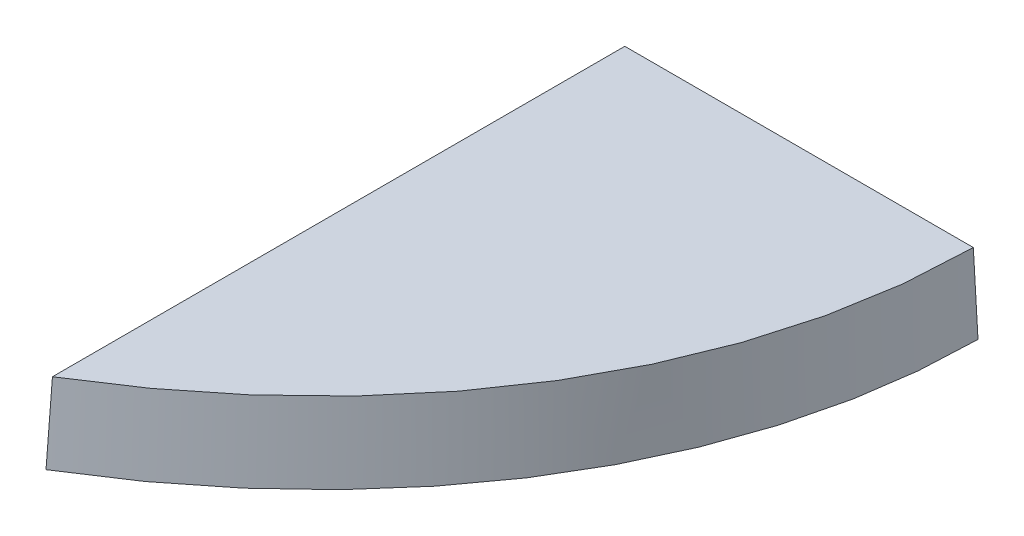
ISO-10303-21;
HEADER;
FILE_DESCRIPTION(('STEP AP214'),'2;1');
FILE_NAME('part.step','',(''),(''),'','','');
FILE_SCHEMA(('AUTOMOTIVE_DESIGN { 1 0 10303 214 1 1 1 1 }'));
ENDSEC;
DATA;
#1=APPLICATION_CONTEXT('core data for automotive mechanical design processes');
#2=APPLICATION_PROTOCOL_DEFINITION('international standard','automotive_design',2000,#1);
#3=PRODUCT_CONTEXT('',#1,'mechanical');
#4=PRODUCT('Part','Part','',(#3));
#5=PRODUCT_RELATED_PRODUCT_CATEGORY('part','',(#4));
#6=PRODUCT_DEFINITION_FORMATION('','',#4);
#7=PRODUCT_DEFINITION_CONTEXT('part definition',#1,'design');
#8=PRODUCT_DEFINITION('design','',#6,#7);
#9=PRODUCT_DEFINITION_SHAPE('','',#8);
#10=(LENGTH_UNIT() NAMED_UNIT(*) SI_UNIT(.MILLI.,.METRE.));
#11=(NAMED_UNIT(*) PLANE_ANGLE_UNIT() SI_UNIT($,.RADIAN.));
#12=(NAMED_UNIT(*) SI_UNIT($,.STERADIAN.) SOLID_ANGLE_UNIT());
#13=UNCERTAINTY_MEASURE_WITH_UNIT(LENGTH_MEASURE(1.E-05),#10,'distance_accuracy_value','');
#14=(GEOMETRIC_REPRESENTATION_CONTEXT(3) GLOBAL_UNCERTAINTY_ASSIGNED_CONTEXT((#13)) GLOBAL_UNIT_ASSIGNED_CONTEXT((#10,
#11,#12)) REPRESENTATION_CONTEXT('',''));
#15=CARTESIAN_POINT('',(0.,0.,0.));
#16=DIRECTION('',(0.,0.,1.));
#17=DIRECTION('',(1.,0.,0.));
#18=AXIS2_PLACEMENT_3D('',#15,#16,#17);
#19=CARTESIAN_POINT('',(0.,0.,0.));
#20=DIRECTION('',(0.,0.,1.));
#21=DIRECTION('',(1.,0.,0.));
#22=AXIS2_PLACEMENT_3D('',#19,#20,#21);
#23=PLANE('',#22);
#24=CARTESIAN_POINT('',(37.2881564006706,-186.5,0.));
#25=CARTESIAN_POINT('',(37.3587709337804,-187.666666666667,0.));
#26=CARTESIAN_POINT('',(37.4293854668902,-188.833333333333,0.));
#27=CARTESIAN_POINT('',(37.5,-190.,0.));
#28=B_SPLINE_CURVE_WITH_KNOTS('',3,(#24,#25,#26,#27),.UNSPECIFIED.,.F.,.F.,(4,4),(0.,
3.50640524049584),.UNSPECIFIED.);
#29=CARTESIAN_POINT('',(37.2881564006706,-186.5,0.));
#30=VERTEX_POINT('',#29);
#31=CARTESIAN_POINT('',(37.5,-190.,0.));
#32=VERTEX_POINT('',#31);
#33=EDGE_CURVE('E88',#30,#32,#28,.T.);
#34=ORIENTED_EDGE('',*,*,#33,.T.);
#35=DIRECTION('',(1.,0.,0.));
#36=VECTOR('',#35,1.);
#37=CARTESIAN_POINT('',(0.,-190.,0.));
#38=LINE('',#37,#36);
#39=CARTESIAN_POINT('',(21.5,-190.,0.));
#40=VERTEX_POINT('',#39);
#41=EDGE_CURVE('E79',#40,#32,#38,.T.);
#42=ORIENTED_EDGE('',*,*,#41,.F.);
#43=DIRECTION('',(0.,-1.,0.));
#44=VECTOR('',#43,1.);
#45=CARTESIAN_POINT('',(21.4999999999996,0.,0.));
#46=LINE('',#45,#44);
#47=CARTESIAN_POINT('',(21.5000000005769,-186.5,0.));
#48=VERTEX_POINT('',#47);
#49=EDGE_CURVE('E154',#48,#40,#46,.T.);
#50=ORIENTED_EDGE('',*,*,#49,.F.);
#51=DIRECTION('',(-1.,0.,0.));
#52=VECTOR('',#51,1.);
#53=CARTESIAN_POINT('',(0.,-186.5,0.));
#54=LINE('',#53,#52);
#55=EDGE_CURVE('E62',#30,#48,#54,.T.);
#56=ORIENTED_EDGE('',*,*,#55,.F.);
#57=EDGE_LOOP('',(#34,#42,#50,#56));
#58=FACE_BOUND('',#57,.T.);
#59=ADVANCED_FACE('F43',(#58),#23,.F.);
#60=CARTESIAN_POINT('',(21.5,-176.5,20.8978327647945));
#61=DIRECTION('',(-1.,0.,0.));
#62=DIRECTION('',(0.,-1.,0.));
#63=AXIS2_PLACEMENT_3D('',#60,#61,#62);
#64=PLANE('',#63);
#65=CARTESIAN_POINT('',(21.5,-186.5,25.9269520773484));
#66=CARTESIAN_POINT('',(21.5,-187.083331798923,25.975530300075));
#67=CARTESIAN_POINT('',(21.5,-187.666664365051,26.0240993066086));
#68=CARTESIAN_POINT('',(21.5000000000001,-188.833331031718,26.1212188872896));
#69=CARTESIAN_POINT('',(21.5000000000001,-189.416665132256,26.169769461437));
#70=CARTESIAN_POINT('',(21.5000000000001,-190.,26.2183108193915));
#71=B_SPLINE_CURVE_WITH_KNOTS('',3,(#65,#66,#67,#68,#69,#70),.UNSPECIFIED.,.F.,.F.,(4,2,4),(0.,
1.75605309712185,3.51210619424374),.UNSPECIFIED.);
#72=CARTESIAN_POINT('',(21.5,-186.5,25.9269520773484));
#73=VERTEX_POINT('',#72);
#74=CARTESIAN_POINT('',(21.499999810714,-190.,26.2183113624354));
#75=VERTEX_POINT('',#74);
#76=EDGE_CURVE('E82',#73,#75,#71,.T.);
#77=ORIENTED_EDGE('',*,*,#76,.F.);
#78=DIRECTION('',(0.,0.,-1.));
#79=VECTOR('',#78,1.);
#80=CARTESIAN_POINT('',(21.5,-186.5,20.8978327647945));
#81=LINE('',#80,#79);
#82=EDGE_CURVE('E11',#73,#48,#81,.T.);
#83=ORIENTED_EDGE('',*,*,#82,.T.);
#84=ORIENTED_EDGE('',*,*,#49,.T.);
#85=DIRECTION('',(0.,0.,1.));
#86=VECTOR('',#85,1.);
#87=CARTESIAN_POINT('',(21.5000000000001,-190.,0.));
#88=LINE('',#87,#86);
#89=EDGE_CURVE('E52',#40,#75,#88,.T.);
#90=ORIENTED_EDGE('',*,*,#89,.T.);
#91=EDGE_LOOP('',(#77,#83,#84,#90));
#92=FACE_BOUND('',#91,.T.);
#93=ADVANCED_FACE('F139',(#92),#64,.T.);
#94=CARTESIAN_POINT('',(0.,-186.5,0.));
#95=DIRECTION('',(0.,1.,0.));
#96=DIRECTION('',(0.,0.,1.));
#97=AXIS2_PLACEMENT_3D('',#94,#95,#96);
#98=PLANE('',#97);
#99=ORIENTED_EDGE('',*,*,#55,.T.);
#100=ORIENTED_EDGE('',*,*,#82,.F.);
#101=CARTESIAN_POINT('',(37.2881564006706,-186.5,0.));
#102=CARTESIAN_POINT('',(37.2881739386405,-186.5,0.422903324363381));
#103=CARTESIAN_POINT('',(37.2782296117488,-186.5,0.845803720653572));
#104=CARTESIAN_POINT('',(37.238524610671,-186.5,1.69056834842758));
#105=CARTESIAN_POINT('',(37.208768861769,-186.5,2.11243281129612));
#106=CARTESIAN_POINT('',(37.129552219119,-186.5,2.95426478164628));
#107=CARTESIAN_POINT('',(37.0800932729535,-186.5,3.3742324724681));
#108=CARTESIAN_POINT('',(36.9617775016913,-186.5,4.21065946178105));
#109=CARTESIAN_POINT('',(36.8929553953594,-186.5,4.62712367806374));
#110=CARTESIAN_POINT('',(36.7361347897031,-186.5,5.45646286973867));
#111=CARTESIAN_POINT('',(36.6481348670975,-186.5,5.86933757636935));
#112=CARTESIAN_POINT('',(36.4533014390875,-186.5,6.69063367071524));
#113=CARTESIAN_POINT('',(36.3464660283281,-186.5,7.09905460345438));
#114=CARTESIAN_POINT('',(36.0199610759236,-186.5,8.24060158674313));
#115=CARTESIAN_POINT('',(35.7791653694555,-186.5,8.96779785169324));
#116=CARTESIAN_POINT('',(35.2397348249139,-186.5,10.4003718399625));
#117=CARTESIAN_POINT('',(34.9410929387796,-186.5,11.1057468923962));
#118=CARTESIAN_POINT('',(34.2889830345068,-186.5,12.4913878231345));
#119=CARTESIAN_POINT('',(33.9354692527078,-186.5,13.1716321505312));
#120=CARTESIAN_POINT('',(33.1774333618991,-186.5,14.5030007581797));
#121=CARTESIAN_POINT('',(32.7729117049583,-186.5,15.1541252964429));
#122=CARTESIAN_POINT('',(31.8876813466141,-186.5,16.4674645931478));
#123=CARTESIAN_POINT('',(31.4036709620472,-186.5,17.1274535466822));
#124=CARTESIAN_POINT('',(30.3864817692636,-186.5,18.4084174207044));
#125=CARTESIAN_POINT('',(29.8532973788627,-186.5,19.029387898368));
#126=CARTESIAN_POINT('',(28.7424166262861,-186.5,20.2301802543944));
#127=CARTESIAN_POINT('',(28.1647164173987,-186.5,20.8099985683714));
#128=CARTESIAN_POINT('',(26.9695192954624,-186.5,21.9266992963638));
#129=CARTESIAN_POINT('',(26.3520312678906,-186.5,22.4635912371614));
#130=CARTESIAN_POINT('',(25.0490600586709,-186.5,23.5196920026453));
#131=CARTESIAN_POINT('',(24.3617150894143,-186.5,24.0366007760983));
#132=CARTESIAN_POINT('',(22.9544602028545,-186.5,25.0195721826122));
#133=CARTESIAN_POINT('',(22.2346483322678,-186.5,25.4857750737236));
#134=CARTESIAN_POINT('',(21.5,-186.5,25.9269520773484));
#135=B_SPLINE_CURVE_WITH_KNOTS('',3,(#101,#102,#103,#104,#105,#106,#107,#108,#109,#110,#111,
#112,#113,#114,#115,#116,#117,#118,#119,#120,#121,#122,#123,#124,#125,#126,#127,#128,#129,#130,
#131,#132,#133,#134),.UNSPECIFIED.,.F.,.F.,(4,2,2,2,2,2,2,2,2,2,2,2,2,2,2,2,4),(0.,
1.26858815625591,2.53686104866096,3.80500860842859,5.07089667348734,6.3368787184059,
7.60298890073354,9.89830290587039,12.1938967514507,14.4914155335484,16.7889139548002,
19.2417238940419,21.6948126173466,24.1481135557631,26.600868505433,29.1787734111305,
31.7493557652304),.UNSPECIFIED.);
#136=EDGE_CURVE('E91',#30,#73,#135,.T.);
#137=ORIENTED_EDGE('',*,*,#136,.F.);
#138=EDGE_LOOP('',(#99,#100,#137));
#139=FACE_BOUND('',#138,.T.);
#140=ADVANCED_FACE('F112',(#139),#98,.T.);
#141=CARTESIAN_POINT('',(-0.0942476803876341,-190.,31.9998989353041));
#142=CARTESIAN_POINT('',(0.,0.,17.5));
#143=CARTESIAN_POINT('',(0.000942476803874733,1.9,17.355001010647));
#144=CARTESIAN_POINT('',(74.9055154492315,-190.,32.1607483098324));
#145=CARTESIAN_POINT('',(52.,0.,17.5));
#146=CARTESIAN_POINT('',(51.7709448455077,1.9,17.3533925169017));
#147=CARTESIAN_POINT('',(75.0940108100067,-190.,-31.839049560776));
#148=CARTESIAN_POINT('',(52.,0.,-17.5));
#149=CARTESIAN_POINT('',(51.7690598918999,1.9,-17.3566095043922));
#150=CARTESIAN_POINT('',(0.0942476803875962,-190.,-31.9998989353041));
#151=CARTESIAN_POINT('',(0.,0.,-17.5));
#152=CARTESIAN_POINT('',(-0.000942476803871138,1.9,-17.355001010647));
#153=CARTESIAN_POINT('',(-74.9055154492314,-190.,-32.1607483098323));
#154=CARTESIAN_POINT('',(-52.,0.,-17.5));
#155=CARTESIAN_POINT('',(-51.7709448455077,1.9,-17.3533925169017));
#156=CARTESIAN_POINT('',(-75.0940108100066,-190.,31.839049560776));
#157=CARTESIAN_POINT('',(-52.,0.,17.5));
#158=CARTESIAN_POINT('',(-51.7690598918999,1.9,17.3566095043922));
#159=CARTESIAN_POINT('',(-0.0942476803876341,-190.,31.9998989353041));
#160=CARTESIAN_POINT('',(0.,0.,17.5));
#161=CARTESIAN_POINT('',(0.000942476803874733,1.9,17.355001010647));
#162=(BOUNDED_SURFACE() B_SPLINE_SURFACE(3,1,((#141,#142,#143),(#144,#145,#146),(#147,#148,
#149),(#150,#151,#152),(#153,#154,#155),(#156,#157,#158),(#159,#160,#161)),.UNSPECIFIED.,.T.,
.F.,.F.) B_SPLINE_SURFACE_WITH_KNOTS((4,3,4),(2,1,2),(0.,0.5,1.),(0.,1.,1.01),
.UNSPECIFIED.) GEOMETRIC_REPRESENTATION_ITEM() RATIONAL_B_SPLINE_SURFACE(((1.,1.,1.),
(0.333333333333333,0.333333333333333,0.333333333333333),(0.333333333333333,0.333333333333333,
0.333333333333333),(1.,1.,1.),(0.333333333333333,0.333333333333333,0.333333333333333),
(0.333333333333333,0.333333333333333,0.333333333333333),(1.,1.,1.))) REPRESENTATION_ITEM('') SURFACE());
#163=CARTESIAN_POINT('',(0.,-190.,0.));
#164=DIRECTION('',(0.,1.,0.));
#165=DIRECTION('',(1.,0.,0.));
#166=AXIS2_PLACEMENT_3D('',#163,#164,#165);
#167=ELLIPSE('',#166,37.5,32.);
#168=EDGE_CURVE('E50',#75,#32,#167,.T.);
#169=ORIENTED_EDGE('',*,*,#33,.F.);
#170=ORIENTED_EDGE('',*,*,#136,.T.);
#171=ORIENTED_EDGE('',*,*,#76,.T.);
#172=ORIENTED_EDGE('',*,*,#168,.T.);
#173=EDGE_LOOP('',(#169,#170,#171,#172));
#174=FACE_BOUND('',#173,.T.);
#175=ADVANCED_FACE('F92',(#174),#162,.T.);
#176=CARTESIAN_POINT('',(0.,-190.,0.));
#177=DIRECTION('',(0.,1.,0.));
#178=DIRECTION('',(0.,0.,1.));
#179=AXIS2_PLACEMENT_3D('',#176,#177,#178);
#180=PLANE('',#179);
#181=ORIENTED_EDGE('',*,*,#89,.F.);
#182=ORIENTED_EDGE('',*,*,#41,.T.);
#183=ORIENTED_EDGE('',*,*,#168,.F.);
#184=EDGE_LOOP('',(#181,#182,#183));
#185=FACE_BOUND('',#184,.T.);
#186=ADVANCED_FACE('F85',(#185),#180,.F.);
#187=CLOSED_SHELL('',(#59,#93,#140,#175,#186));
#188=MANIFOLD_SOLID_BREP('B2',#187);
#189=ADVANCED_BREP_SHAPE_REPRESENTATION('',(#18,#188),#14);
#190=SHAPE_DEFINITION_REPRESENTATION(#9,#189);
ENDSEC;
END-ISO-10303-21;
